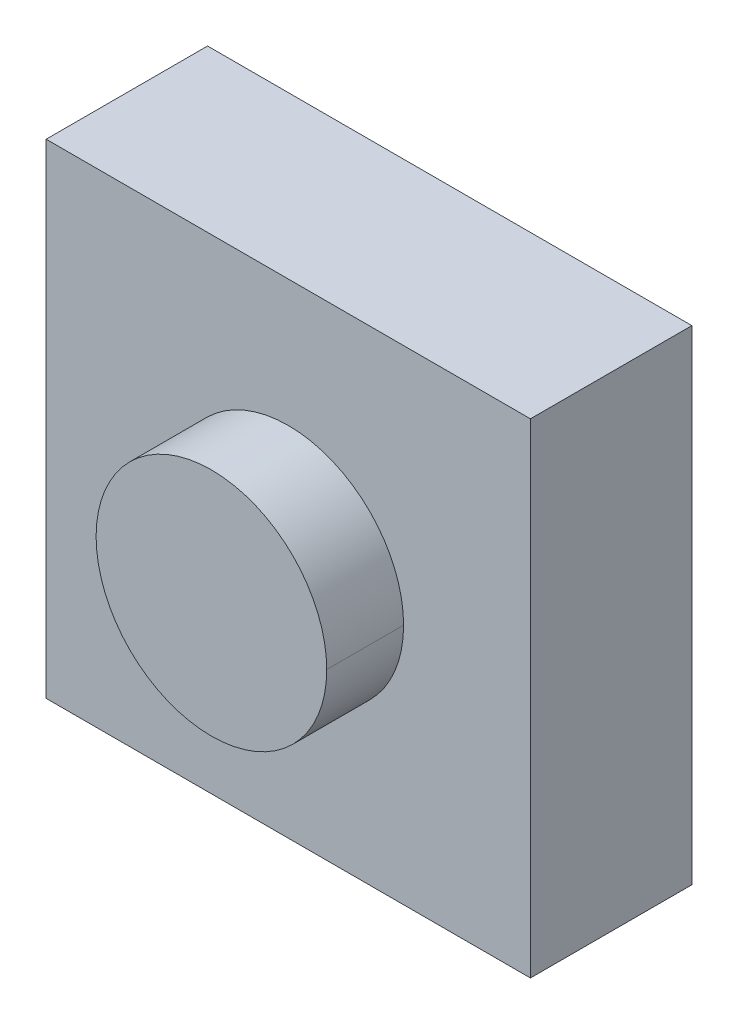
ISO-10303-21;
HEADER;
FILE_DESCRIPTION(('STEP AP214'),'2;1');
FILE_NAME('part.step','',(''),(''),'','','');
FILE_SCHEMA(('AUTOMOTIVE_DESIGN { 1 0 10303 214 1 1 1 1 }'));
ENDSEC;
DATA;
#1=APPLICATION_CONTEXT('core data for automotive mechanical design processes');
#2=APPLICATION_PROTOCOL_DEFINITION('international standard','automotive_design',2000,#1);
#3=PRODUCT_CONTEXT('',#1,'mechanical');
#4=PRODUCT('Part','Part','',(#3));
#5=PRODUCT_RELATED_PRODUCT_CATEGORY('part','',(#4));
#6=PRODUCT_DEFINITION_FORMATION('','',#4);
#7=PRODUCT_DEFINITION_CONTEXT('part definition',#1,'design');
#8=PRODUCT_DEFINITION('design','',#6,#7);
#9=PRODUCT_DEFINITION_SHAPE('','',#8);
#10=(LENGTH_UNIT() NAMED_UNIT(*) SI_UNIT(.MILLI.,.METRE.));
#11=(NAMED_UNIT(*) PLANE_ANGLE_UNIT() SI_UNIT($,.RADIAN.));
#12=(NAMED_UNIT(*) SI_UNIT($,.STERADIAN.) SOLID_ANGLE_UNIT());
#13=UNCERTAINTY_MEASURE_WITH_UNIT(LENGTH_MEASURE(1.E-05),#10,'distance_accuracy_value','');
#14=(GEOMETRIC_REPRESENTATION_CONTEXT(3) GLOBAL_UNCERTAINTY_ASSIGNED_CONTEXT((#13)) GLOBAL_UNIT_ASSIGNED_CONTEXT((#10,
#11,#12)) REPRESENTATION_CONTEXT('',''));
#15=CARTESIAN_POINT('',(0.,0.,0.));
#16=DIRECTION('',(0.,0.,1.));
#17=DIRECTION('',(1.,0.,0.));
#18=AXIS2_PLACEMENT_3D('',#15,#16,#17);
#19=CARTESIAN_POINT('',(0.,0.,3.1));
#20=DIRECTION('',(0.,0.,-1.));
#21=DIRECTION('',(-1.,0.,0.));
#22=AXIS2_PLACEMENT_3D('',#19,#20,#21);
#23=CYLINDRICAL_SURFACE('',#22,1.5);
#24=CARTESIAN_POINT('',(0.,0.,3.1));
#25=DIRECTION('',(0.,0.,1.));
#26=DIRECTION('',(1.,0.,0.));
#27=AXIS2_PLACEMENT_3D('',#24,#25,#26);
#28=CIRCLE('',#27,1.5);
#29=CARTESIAN_POINT('',(1.5,0.,3.1));
#30=VERTEX_POINT('',#29);
#31=CARTESIAN_POINT('',(-1.5,0.,3.1));
#32=VERTEX_POINT('',#31);
#33=EDGE_CURVE('E11',#30,#32,#28,.T.);
#34=ORIENTED_EDGE('',*,*,#33,.F.);
#35=DIRECTION('',(0.,0.,-1.));
#36=VECTOR('',#35,1.);
#37=CARTESIAN_POINT('',(1.5,0.,3.1));
#38=LINE('',#37,#36);
#39=CARTESIAN_POINT('',(1.5,0.,2.1));
#40=VERTEX_POINT('',#39);
#41=EDGE_CURVE('E24',#30,#40,#38,.T.);
#42=ORIENTED_EDGE('',*,*,#41,.T.);
#43=CARTESIAN_POINT('',(0.,0.,2.1));
#44=DIRECTION('',(0.,0.,1.));
#45=DIRECTION('',(1.,0.,0.));
#46=AXIS2_PLACEMENT_3D('',#43,#44,#45);
#47=CIRCLE('',#46,1.5);
#48=CARTESIAN_POINT('',(-1.5,0.,2.1));
#49=VERTEX_POINT('',#48);
#50=EDGE_CURVE('E116',#40,#49,#47,.T.);
#51=ORIENTED_EDGE('',*,*,#50,.T.);
#52=DIRECTION('',(0.,0.,-1.));
#53=VECTOR('',#52,1.);
#54=CARTESIAN_POINT('',(-1.5,0.,3.1));
#55=LINE('',#54,#53);
#56=EDGE_CURVE('E113',#32,#49,#55,.T.);
#57=ORIENTED_EDGE('',*,*,#56,.F.);
#58=EDGE_LOOP('',(#34,#42,#51,#57));
#59=FACE_BOUND('',#58,.T.);
#60=ADVANCED_FACE('F17',(#59),#23,.T.);
#61=CARTESIAN_POINT('',(-3.15,-3.15,2.1));
#62=DIRECTION('',(1.,0.,0.));
#63=DIRECTION('',(0.,0.,-1.));
#64=AXIS2_PLACEMENT_3D('',#61,#62,#63);
#65=PLANE('',#64);
#66=DIRECTION('',(0.,-1.,0.));
#67=VECTOR('',#66,1.);
#68=CARTESIAN_POINT('',(-3.15,-3.15,0.));
#69=LINE('',#68,#67);
#70=CARTESIAN_POINT('',(-3.15,3.15,0.));
#71=VERTEX_POINT('',#70);
#72=CARTESIAN_POINT('',(-3.15,-3.15,0.));
#73=VERTEX_POINT('',#72);
#74=EDGE_CURVE('E111',#71,#73,#69,.T.);
#75=ORIENTED_EDGE('',*,*,#74,.T.);
#76=DIRECTION('',(0.,0.,-1.));
#77=VECTOR('',#76,1.);
#78=CARTESIAN_POINT('',(-3.15,-3.15,2.1));
#79=LINE('',#78,#77);
#80=CARTESIAN_POINT('',(-3.15,-3.15,2.1));
#81=VERTEX_POINT('',#80);
#82=EDGE_CURVE('E108',#81,#73,#79,.T.);
#83=ORIENTED_EDGE('',*,*,#82,.F.);
#84=DIRECTION('',(0.,-1.,0.));
#85=VECTOR('',#84,1.);
#86=CARTESIAN_POINT('',(-3.15,-3.15,2.1));
#87=LINE('',#86,#85);
#88=CARTESIAN_POINT('',(-3.15,3.15,2.1));
#89=VERTEX_POINT('',#88);
#90=EDGE_CURVE('E106',#89,#81,#87,.T.);
#91=ORIENTED_EDGE('',*,*,#90,.F.);
#92=DIRECTION('',(0.,0.,-1.));
#93=VECTOR('',#92,1.);
#94=CARTESIAN_POINT('',(-3.15,3.15,2.1));
#95=LINE('',#94,#93);
#96=EDGE_CURVE('E90',#89,#71,#95,.T.);
#97=ORIENTED_EDGE('',*,*,#96,.T.);
#98=EDGE_LOOP('',(#75,#83,#91,#97));
#99=FACE_BOUND('',#98,.T.);
#100=ADVANCED_FACE('F133',(#99),#65,.F.);
#101=CARTESIAN_POINT('',(3.15,-3.15,2.1));
#102=DIRECTION('',(0.,1.,0.));
#103=DIRECTION('',(-1.,0.,0.));
#104=AXIS2_PLACEMENT_3D('',#101,#102,#103);
#105=PLANE('',#104);
#106=DIRECTION('',(1.,0.,0.));
#107=VECTOR('',#106,1.);
#108=CARTESIAN_POINT('',(3.15,-3.15,0.));
#109=LINE('',#108,#107);
#110=CARTESIAN_POINT('',(3.15,-3.15,0.));
#111=VERTEX_POINT('',#110);
#112=EDGE_CURVE('E103',#73,#111,#109,.T.);
#113=ORIENTED_EDGE('',*,*,#112,.T.);
#114=DIRECTION('',(0.,0.,-1.));
#115=VECTOR('',#114,1.);
#116=CARTESIAN_POINT('',(3.15,-3.15,2.1));
#117=LINE('',#116,#115);
#118=CARTESIAN_POINT('',(3.15,-3.15,2.1));
#119=VERTEX_POINT('',#118);
#120=EDGE_CURVE('E101',#119,#111,#117,.T.);
#121=ORIENTED_EDGE('',*,*,#120,.F.);
#122=DIRECTION('',(1.,0.,0.));
#123=VECTOR('',#122,1.);
#124=CARTESIAN_POINT('',(3.15,-3.15,2.1));
#125=LINE('',#124,#123);
#126=EDGE_CURVE('E84',#81,#119,#125,.T.);
#127=ORIENTED_EDGE('',*,*,#126,.F.);
#128=ORIENTED_EDGE('',*,*,#82,.T.);
#129=EDGE_LOOP('',(#113,#121,#127,#128));
#130=FACE_BOUND('',#129,.T.);
#131=ADVANCED_FACE('F137',(#130),#105,.F.);
#132=CARTESIAN_POINT('',(3.15,-3.15,2.1));
#133=DIRECTION('',(-1.,0.,0.));
#134=DIRECTION('',(0.,0.,1.));
#135=AXIS2_PLACEMENT_3D('',#132,#133,#134);
#136=PLANE('',#135);
#137=DIRECTION('',(0.,1.,0.));
#138=VECTOR('',#137,1.);
#139=CARTESIAN_POINT('',(3.15,-3.15,0.));
#140=LINE('',#139,#138);
#141=CARTESIAN_POINT('',(3.15,3.15,0.));
#142=VERTEX_POINT('',#141);
#143=EDGE_CURVE('E71',#111,#142,#140,.T.);
#144=ORIENTED_EDGE('',*,*,#143,.T.);
#145=DIRECTION('',(0.,0.,-1.));
#146=VECTOR('',#145,1.);
#147=CARTESIAN_POINT('',(3.15,3.15,2.1));
#148=LINE('',#147,#146);
#149=CARTESIAN_POINT('',(3.15,3.15,2.1));
#150=VERTEX_POINT('',#149);
#151=EDGE_CURVE('E65',#150,#142,#148,.T.);
#152=ORIENTED_EDGE('',*,*,#151,.F.);
#153=DIRECTION('',(0.,1.,0.));
#154=VECTOR('',#153,1.);
#155=CARTESIAN_POINT('',(3.15,-3.15,2.1));
#156=LINE('',#155,#154);
#157=EDGE_CURVE('E69',#119,#150,#156,.T.);
#158=ORIENTED_EDGE('',*,*,#157,.F.);
#159=ORIENTED_EDGE('',*,*,#120,.T.);
#160=EDGE_LOOP('',(#144,#152,#158,#159));
#161=FACE_BOUND('',#160,.T.);
#162=ADVANCED_FACE('F67',(#161),#136,.F.);
#163=CARTESIAN_POINT('',(3.15,3.15,2.1));
#164=DIRECTION('',(0.,-1.,0.));
#165=DIRECTION('',(1.,0.,0.));
#166=AXIS2_PLACEMENT_3D('',#163,#164,#165);
#167=PLANE('',#166);
#168=DIRECTION('',(-1.,0.,0.));
#169=VECTOR('',#168,1.);
#170=CARTESIAN_POINT('',(3.15,3.15,0.));
#171=LINE('',#170,#169);
#172=EDGE_CURVE('E85',#142,#71,#171,.T.);
#173=ORIENTED_EDGE('',*,*,#172,.T.);
#174=ORIENTED_EDGE('',*,*,#96,.F.);
#175=DIRECTION('',(-1.,0.,0.));
#176=VECTOR('',#175,1.);
#177=CARTESIAN_POINT('',(3.15,3.15,2.1));
#178=LINE('',#177,#176);
#179=EDGE_CURVE('E82',#150,#89,#178,.T.);
#180=ORIENTED_EDGE('',*,*,#179,.F.);
#181=ORIENTED_EDGE('',*,*,#151,.T.);
#182=EDGE_LOOP('',(#173,#174,#180,#181));
#183=FACE_BOUND('',#182,.T.);
#184=ADVANCED_FACE('F88',(#183),#167,.F.);
#185=CARTESIAN_POINT('',(0.,0.,2.1));
#186=DIRECTION('',(0.,0.,1.));
#187=DIRECTION('',(1.,0.,0.));
#188=AXIS2_PLACEMENT_3D('',#185,#186,#187);
#189=PLANE('',#188);
#190=CARTESIAN_POINT('',(0.,0.,2.1));
#191=DIRECTION('',(0.,0.,1.));
#192=DIRECTION('',(1.,0.,0.));
#193=AXIS2_PLACEMENT_3D('',#190,#191,#192);
#194=CIRCLE('',#193,1.5);
#195=EDGE_CURVE('E91',#49,#40,#194,.T.);
#196=ORIENTED_EDGE('',*,*,#195,.F.);
#197=ORIENTED_EDGE('',*,*,#50,.F.);
#198=EDGE_LOOP('',(#196,#197));
#199=FACE_BOUND('',#198,.T.);
#200=ORIENTED_EDGE('',*,*,#90,.T.);
#201=ORIENTED_EDGE('',*,*,#126,.T.);
#202=ORIENTED_EDGE('',*,*,#157,.T.);
#203=ORIENTED_EDGE('',*,*,#179,.T.);
#204=EDGE_LOOP('',(#200,#201,#202,#203));
#205=FACE_BOUND('',#204,.T.);
#206=ADVANCED_FACE('F81',(#199,#205),#189,.T.);
#207=CARTESIAN_POINT('',(0.,0.,0.));
#208=DIRECTION('',(0.,0.,1.));
#209=DIRECTION('',(1.,0.,0.));
#210=AXIS2_PLACEMENT_3D('',#207,#208,#209);
#211=PLANE('',#210);
#212=ORIENTED_EDGE('',*,*,#74,.F.);
#213=ORIENTED_EDGE('',*,*,#172,.F.);
#214=ORIENTED_EDGE('',*,*,#143,.F.);
#215=ORIENTED_EDGE('',*,*,#112,.F.);
#216=EDGE_LOOP('',(#212,#213,#214,#215));
#217=FACE_BOUND('',#216,.T.);
#218=ADVANCED_FACE('F130',(#217),#211,.F.);
#219=CARTESIAN_POINT('',(0.,0.,3.1));
#220=DIRECTION('',(0.,0.,-1.));
#221=DIRECTION('',(-1.,0.,0.));
#222=AXIS2_PLACEMENT_3D('',#219,#220,#221);
#223=CYLINDRICAL_SURFACE('',#222,1.5);
#224=ORIENTED_EDGE('',*,*,#41,.F.);
#225=CARTESIAN_POINT('',(0.,0.,3.1));
#226=DIRECTION('',(0.,0.,1.));
#227=DIRECTION('',(1.,0.,0.));
#228=AXIS2_PLACEMENT_3D('',#225,#226,#227);
#229=CIRCLE('',#228,1.5);
#230=EDGE_CURVE('E95',#32,#30,#229,.T.);
#231=ORIENTED_EDGE('',*,*,#230,.F.);
#232=ORIENTED_EDGE('',*,*,#56,.T.);
#233=ORIENTED_EDGE('',*,*,#195,.T.);
#234=EDGE_LOOP('',(#224,#231,#232,#233));
#235=FACE_BOUND('',#234,.T.);
#236=ADVANCED_FACE('F122',(#235),#223,.T.);
#237=CARTESIAN_POINT('',(0.,0.,3.1));
#238=DIRECTION('',(0.,0.,1.));
#239=DIRECTION('',(1.,0.,0.));
#240=AXIS2_PLACEMENT_3D('',#237,#238,#239);
#241=PLANE('',#240);
#242=ORIENTED_EDGE('',*,*,#230,.T.);
#243=ORIENTED_EDGE('',*,*,#33,.T.);
#244=EDGE_LOOP('',(#242,#243));
#245=FACE_BOUND('',#244,.T.);
#246=ADVANCED_FACE('F123',(#245),#241,.T.);
#247=CLOSED_SHELL('',(#60,#100,#131,#162,#184,#206,#218,#236,#246));
#248=MANIFOLD_SOLID_BREP('B1',#247);
#249=ADVANCED_BREP_SHAPE_REPRESENTATION('',(#18,#248),#14);
#250=SHAPE_DEFINITION_REPRESENTATION(#9,#249);
ENDSEC;
END-ISO-10303-21;
